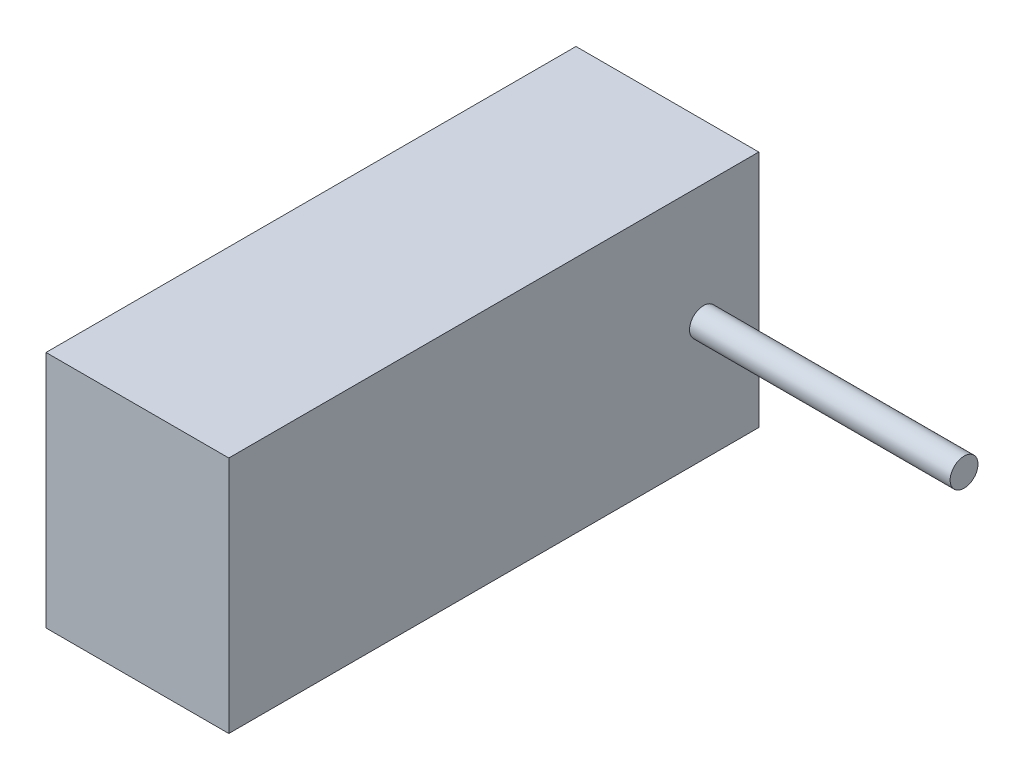
ISO-10303-21;
HEADER;
FILE_DESCRIPTION(('STEP AP214'),'2;1');
FILE_NAME('part.step','',(''),(''),'','','');
FILE_SCHEMA(('AUTOMOTIVE_DESIGN { 1 0 10303 214 1 1 1 1 }'));
ENDSEC;
DATA;
#1=APPLICATION_CONTEXT('core data for automotive mechanical design processes');
#2=APPLICATION_PROTOCOL_DEFINITION('international standard','automotive_design',2000,#1);
#3=PRODUCT_CONTEXT('',#1,'mechanical');
#4=PRODUCT('Part','Part','',(#3));
#5=PRODUCT_RELATED_PRODUCT_CATEGORY('part','',(#4));
#6=PRODUCT_DEFINITION_FORMATION('','',#4);
#7=PRODUCT_DEFINITION_CONTEXT('part definition',#1,'design');
#8=PRODUCT_DEFINITION('design','',#6,#7);
#9=PRODUCT_DEFINITION_SHAPE('','',#8);
#10=(LENGTH_UNIT() NAMED_UNIT(*) SI_UNIT(.MILLI.,.METRE.));
#11=(NAMED_UNIT(*) PLANE_ANGLE_UNIT() SI_UNIT($,.RADIAN.));
#12=(NAMED_UNIT(*) SI_UNIT($,.STERADIAN.) SOLID_ANGLE_UNIT());
#13=UNCERTAINTY_MEASURE_WITH_UNIT(LENGTH_MEASURE(1.E-05),#10,'distance_accuracy_value','');
#14=(GEOMETRIC_REPRESENTATION_CONTEXT(3) GLOBAL_UNCERTAINTY_ASSIGNED_CONTEXT((#13)) GLOBAL_UNIT_ASSIGNED_CONTEXT((#10,
#11,#12)) REPRESENTATION_CONTEXT('',''));
#15=CARTESIAN_POINT('',(0.,0.,0.));
#16=DIRECTION('',(0.,0.,1.));
#17=DIRECTION('',(1.,0.,0.));
#18=AXIS2_PLACEMENT_3D('',#15,#16,#17);
#19=CARTESIAN_POINT('',(0.,25.,0.));
#20=DIRECTION('',(0.,0.,-1.));
#21=DIRECTION('',(-1.,0.,0.));
#22=AXIS2_PLACEMENT_3D('',#19,#20,#21);
#23=PLANE('',#22);
#24=DIRECTION('',(1.,0.,0.));
#25=VECTOR('',#24,1.);
#26=CARTESIAN_POINT('',(0.,0.,0.));
#27=LINE('',#26,#25);
#28=CARTESIAN_POINT('',(0.,0.,0.));
#29=VERTEX_POINT('',#28);
#30=CARTESIAN_POINT('',(19.15,0.,0.));
#31=VERTEX_POINT('',#30);
#32=EDGE_CURVE('E100',#29,#31,#27,.T.);
#33=ORIENTED_EDGE('',*,*,#32,.T.);
#34=DIRECTION('',(0.,-1.,0.));
#35=VECTOR('',#34,1.);
#36=CARTESIAN_POINT('',(19.15,25.,0.));
#37=LINE('',#36,#35);
#38=CARTESIAN_POINT('',(19.15,25.,0.));
#39=VERTEX_POINT('',#38);
#40=EDGE_CURVE('E11',#39,#31,#37,.T.);
#41=ORIENTED_EDGE('',*,*,#40,.F.);
#42=DIRECTION('',(1.,0.,0.));
#43=VECTOR('',#42,1.);
#44=CARTESIAN_POINT('',(0.,25.,0.));
#45=LINE('',#44,#43);
#46=CARTESIAN_POINT('',(0.,25.,0.));
#47=VERTEX_POINT('',#46);
#48=EDGE_CURVE('E77',#47,#39,#45,.T.);
#49=ORIENTED_EDGE('',*,*,#48,.F.);
#50=DIRECTION('',(0.,-1.,0.));
#51=VECTOR('',#50,1.);
#52=CARTESIAN_POINT('',(0.,25.,0.));
#53=LINE('',#52,#51);
#54=EDGE_CURVE('E53',#47,#29,#53,.T.);
#55=ORIENTED_EDGE('',*,*,#54,.T.);
#56=EDGE_LOOP('',(#33,#41,#49,#55));
#57=FACE_BOUND('',#56,.T.);
#58=ADVANCED_FACE('F37',(#57),#23,.F.);
#59=CARTESIAN_POINT('',(19.15,25.,-55.52));
#60=DIRECTION('',(1.,0.,0.));
#61=DIRECTION('',(0.,0.,-1.));
#62=AXIS2_PLACEMENT_3D('',#59,#60,#61);
#63=PLANE('',#62);
#64=CARTESIAN_POINT('',(19.15,12.5,-49.7266501029082));
#65=DIRECTION('',(1.,0.,0.));
#66=DIRECTION('',(0.,0.,-1.));
#67=AXIS2_PLACEMENT_3D('',#64,#65,#66);
#68=CIRCLE('',#67,1.46);
#69=CARTESIAN_POINT('',(19.15,12.5,-51.1866501029082));
#70=VERTEX_POINT('',#69);
#71=EDGE_CURVE('E102',#70,#70,#68,.F.);
#72=ORIENTED_EDGE('',*,*,#71,.T.);
#73=EDGE_LOOP('',(#72));
#74=FACE_BOUND('',#73,.T.);
#75=DIRECTION('',(0.,0.,1.));
#76=VECTOR('',#75,1.);
#77=CARTESIAN_POINT('',(19.15,0.,-55.52));
#78=LINE('',#77,#76);
#79=CARTESIAN_POINT('',(19.15,0.,-55.52));
#80=VERTEX_POINT('',#79);
#81=EDGE_CURVE('E86',#80,#31,#78,.T.);
#82=ORIENTED_EDGE('',*,*,#81,.F.);
#83=DIRECTION('',(0.,-1.,0.));
#84=VECTOR('',#83,1.);
#85=CARTESIAN_POINT('',(19.15,25.,-55.52));
#86=LINE('',#85,#84);
#87=CARTESIAN_POINT('',(19.15,25.,-55.52));
#88=VERTEX_POINT('',#87);
#89=EDGE_CURVE('E45',#88,#80,#86,.T.);
#90=ORIENTED_EDGE('',*,*,#89,.F.);
#91=DIRECTION('',(0.,0.,1.));
#92=VECTOR('',#91,1.);
#93=CARTESIAN_POINT('',(19.15,25.,-55.52));
#94=LINE('',#93,#92);
#95=EDGE_CURVE('E84',#88,#39,#94,.T.);
#96=ORIENTED_EDGE('',*,*,#95,.T.);
#97=ORIENTED_EDGE('',*,*,#40,.T.);
#98=EDGE_LOOP('',(#82,#90,#96,#97));
#99=FACE_BOUND('',#98,.T.);
#100=ADVANCED_FACE('F83',(#74,#99),#63,.T.);
#101=CARTESIAN_POINT('',(0.,25.,-55.52));
#102=DIRECTION('',(0.,0.,-1.));
#103=DIRECTION('',(-1.,0.,0.));
#104=AXIS2_PLACEMENT_3D('',#101,#102,#103);
#105=PLANE('',#104);
#106=DIRECTION('',(1.,0.,0.));
#107=VECTOR('',#106,1.);
#108=CARTESIAN_POINT('',(0.,0.,-55.52));
#109=LINE('',#108,#107);
#110=CARTESIAN_POINT('',(0.,0.,-55.52));
#111=VERTEX_POINT('',#110);
#112=EDGE_CURVE('E104',#111,#80,#109,.T.);
#113=ORIENTED_EDGE('',*,*,#112,.F.);
#114=DIRECTION('',(0.,-1.,0.));
#115=VECTOR('',#114,1.);
#116=CARTESIAN_POINT('',(0.,25.,-55.52));
#117=LINE('',#116,#115);
#118=CARTESIAN_POINT('',(0.,25.,-55.52));
#119=VERTEX_POINT('',#118);
#120=EDGE_CURVE('E66',#119,#111,#117,.T.);
#121=ORIENTED_EDGE('',*,*,#120,.F.);
#122=DIRECTION('',(1.,0.,0.));
#123=VECTOR('',#122,1.);
#124=CARTESIAN_POINT('',(0.,25.,-55.52));
#125=LINE('',#124,#123);
#126=EDGE_CURVE('E92',#119,#88,#125,.T.);
#127=ORIENTED_EDGE('',*,*,#126,.T.);
#128=ORIENTED_EDGE('',*,*,#89,.T.);
#129=EDGE_LOOP('',(#113,#121,#127,#128));
#130=FACE_BOUND('',#129,.T.);
#131=ADVANCED_FACE('F94',(#130),#105,.T.);
#132=CARTESIAN_POINT('',(0.,25.,0.));
#133=DIRECTION('',(-1.,0.,0.));
#134=DIRECTION('',(0.,0.,1.));
#135=AXIS2_PLACEMENT_3D('',#132,#133,#134);
#136=PLANE('',#135);
#137=DIRECTION('',(0.,0.,-1.));
#138=VECTOR('',#137,1.);
#139=CARTESIAN_POINT('',(0.,0.,0.));
#140=LINE('',#139,#138);
#141=EDGE_CURVE('E106',#29,#111,#140,.T.);
#142=ORIENTED_EDGE('',*,*,#141,.F.);
#143=ORIENTED_EDGE('',*,*,#54,.F.);
#144=DIRECTION('',(0.,0.,-1.));
#145=VECTOR('',#144,1.);
#146=CARTESIAN_POINT('',(0.,25.,0.));
#147=LINE('',#146,#145);
#148=EDGE_CURVE('E95',#47,#119,#147,.T.);
#149=ORIENTED_EDGE('',*,*,#148,.T.);
#150=ORIENTED_EDGE('',*,*,#120,.T.);
#151=EDGE_LOOP('',(#142,#143,#149,#150));
#152=FACE_BOUND('',#151,.T.);
#153=ADVANCED_FACE('F140',(#152),#136,.T.);
#154=CARTESIAN_POINT('',(0.,25.,0.));
#155=DIRECTION('',(0.,-1.,0.));
#156=DIRECTION('',(0.,0.,-1.));
#157=AXIS2_PLACEMENT_3D('',#154,#155,#156);
#158=PLANE('',#157);
#159=ORIENTED_EDGE('',*,*,#48,.T.);
#160=ORIENTED_EDGE('',*,*,#95,.F.);
#161=ORIENTED_EDGE('',*,*,#126,.F.);
#162=ORIENTED_EDGE('',*,*,#148,.F.);
#163=EDGE_LOOP('',(#159,#160,#161,#162));
#164=FACE_BOUND('',#163,.T.);
#165=ADVANCED_FACE('F91',(#164),#158,.F.);
#166=CARTESIAN_POINT('',(0.,0.,0.));
#167=DIRECTION('',(0.,-1.,0.));
#168=DIRECTION('',(0.,0.,-1.));
#169=AXIS2_PLACEMENT_3D('',#166,#167,#168);
#170=PLANE('',#169);
#171=ORIENTED_EDGE('',*,*,#32,.F.);
#172=ORIENTED_EDGE('',*,*,#141,.T.);
#173=ORIENTED_EDGE('',*,*,#112,.T.);
#174=ORIENTED_EDGE('',*,*,#81,.T.);
#175=EDGE_LOOP('',(#171,#172,#173,#174));
#176=FACE_BOUND('',#175,.T.);
#177=ADVANCED_FACE('F122',(#176),#170,.T.);
#178=CARTESIAN_POINT('',(46.45,12.5,-49.7266501029082));
#179=DIRECTION('',(-1.,0.,0.));
#180=DIRECTION('',(0.,0.,1.));
#181=AXIS2_PLACEMENT_3D('',#178,#179,#180);
#182=CYLINDRICAL_SURFACE('',#181,1.46);
#183=ORIENTED_EDGE('',*,*,#71,.F.);
#184=EDGE_LOOP('',(#183));
#185=FACE_BOUND('',#184,.T.);
#186=CARTESIAN_POINT('',(46.45,12.5,-49.7266501029082));
#187=DIRECTION('',(1.,0.,0.));
#188=DIRECTION('',(0.,0.,-1.));
#189=AXIS2_PLACEMENT_3D('',#186,#187,#188);
#190=CIRCLE('',#189,1.46);
#191=CARTESIAN_POINT('',(46.45,12.5,-51.1866501029082));
#192=VERTEX_POINT('',#191);
#193=EDGE_CURVE('E114',#192,#192,#190,.T.);
#194=ORIENTED_EDGE('',*,*,#193,.F.);
#195=EDGE_LOOP('',(#194));
#196=FACE_BOUND('',#195,.T.);
#197=ADVANCED_FACE('F120',(#185,#196),#182,.T.);
#198=CARTESIAN_POINT('',(46.45,12.5,-49.7266501029082));
#199=DIRECTION('',(1.,0.,0.));
#200=DIRECTION('',(0.,0.,-1.));
#201=AXIS2_PLACEMENT_3D('',#198,#199,#200);
#202=PLANE('',#201);
#203=ORIENTED_EDGE('',*,*,#193,.T.);
#204=EDGE_LOOP('',(#203));
#205=FACE_BOUND('',#204,.T.);
#206=ADVANCED_FACE('F118',(#205),#202,.T.);
#207=CLOSED_SHELL('',(#58,#100,#131,#153,#165,#177,#197,#206));
#208=MANIFOLD_SOLID_BREP('B2',#207);
#209=ADVANCED_BREP_SHAPE_REPRESENTATION('',(#18,#208),#14);
#210=SHAPE_DEFINITION_REPRESENTATION(#9,#209);
ENDSEC;
END-ISO-10303-21;
